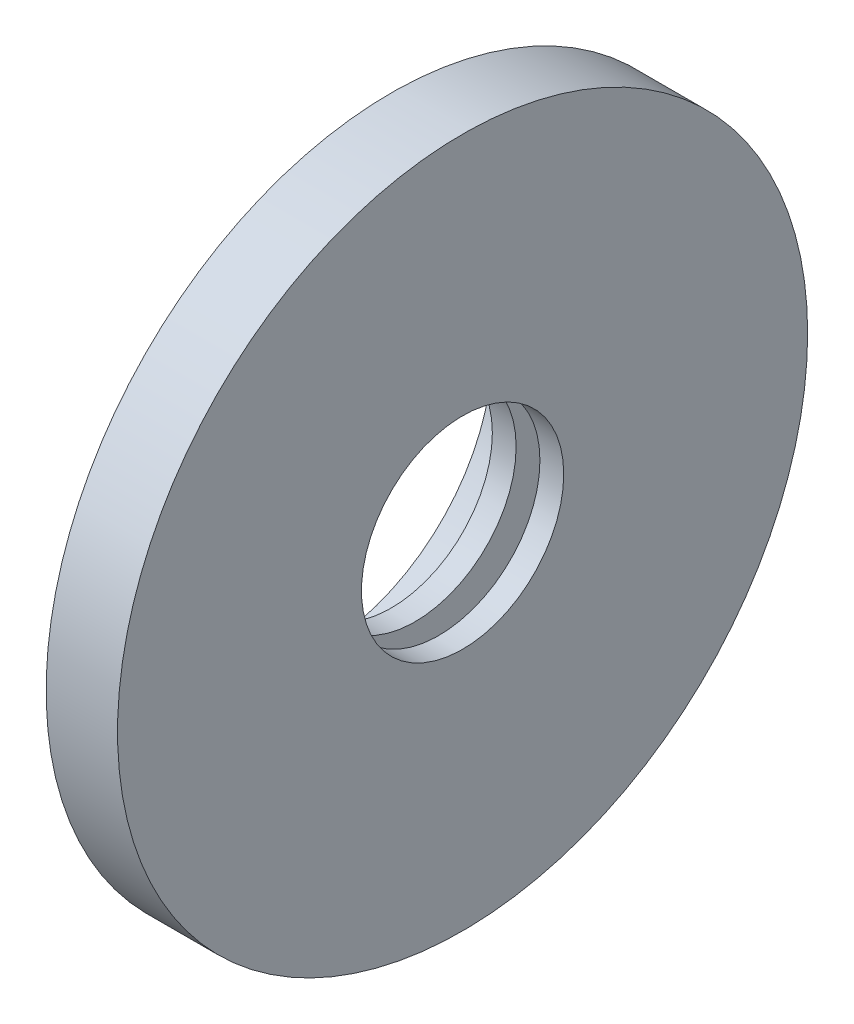
ISO-10303-21;
HEADER;
FILE_DESCRIPTION(('STEP AP214'),'2;1');
FILE_NAME('part.step','',(''),(''),'','','');
FILE_SCHEMA(('AUTOMOTIVE_DESIGN { 1 0 10303 214 1 1 1 1 }'));
ENDSEC;
DATA;
#1=APPLICATION_CONTEXT('core data for automotive mechanical design processes');
#2=APPLICATION_PROTOCOL_DEFINITION('international standard','automotive_design',2000,#1);
#3=PRODUCT_CONTEXT('',#1,'mechanical');
#4=PRODUCT('Part','Part','',(#3));
#5=PRODUCT_RELATED_PRODUCT_CATEGORY('part','',(#4));
#6=PRODUCT_DEFINITION_FORMATION('','',#4);
#7=PRODUCT_DEFINITION_CONTEXT('part definition',#1,'design');
#8=PRODUCT_DEFINITION('design','',#6,#7);
#9=PRODUCT_DEFINITION_SHAPE('','',#8);
#10=(LENGTH_UNIT() NAMED_UNIT(*) SI_UNIT(.MILLI.,.METRE.));
#11=(NAMED_UNIT(*) PLANE_ANGLE_UNIT() SI_UNIT($,.RADIAN.));
#12=(NAMED_UNIT(*) SI_UNIT($,.STERADIAN.) SOLID_ANGLE_UNIT());
#13=UNCERTAINTY_MEASURE_WITH_UNIT(LENGTH_MEASURE(1.E-05),#10,'distance_accuracy_value','');
#14=(GEOMETRIC_REPRESENTATION_CONTEXT(3) GLOBAL_UNCERTAINTY_ASSIGNED_CONTEXT((#13)) GLOBAL_UNIT_ASSIGNED_CONTEXT((#10,
#11,#12)) REPRESENTATION_CONTEXT('',''));
#15=CARTESIAN_POINT('',(0.,0.,0.));
#16=DIRECTION('',(0.,0.,1.));
#17=DIRECTION('',(1.,0.,0.));
#18=AXIS2_PLACEMENT_3D('',#15,#16,#17);
#19=CARTESIAN_POINT('',(0.,0.,0.));
#20=DIRECTION('',(-1.,0.,0.));
#21=DIRECTION('',(0.,0.,1.));
#22=AXIS2_PLACEMENT_3D('',#19,#20,#21);
#23=PLANE('',#22);
#24=CARTESIAN_POINT('',(0.,0.,0.));
#25=DIRECTION('',(1.,0.,0.));
#26=DIRECTION('',(0.,0.,-1.));
#27=AXIS2_PLACEMENT_3D('',#24,#25,#26);
#28=CIRCLE('',#27,8.5);
#29=CARTESIAN_POINT('',(0.,0.,-8.5));
#30=VERTEX_POINT('',#29);
#31=EDGE_CURVE('E72',#30,#30,#28,.T.);
#32=ORIENTED_EDGE('',*,*,#31,.T.);
#33=EDGE_LOOP('',(#32));
#34=FACE_BOUND('',#33,.T.);
#35=CARTESIAN_POINT('',(0.,0.,0.));
#36=DIRECTION('',(1.,0.,0.));
#37=DIRECTION('',(0.,0.,-1.));
#38=AXIS2_PLACEMENT_3D('',#35,#36,#37);
#39=CIRCLE('',#38,14.5);
#40=CARTESIAN_POINT('',(0.,0.,-14.5));
#41=VERTEX_POINT('',#40);
#42=EDGE_CURVE('E10',#41,#41,#39,.T.);
#43=ORIENTED_EDGE('',*,*,#42,.F.);
#44=EDGE_LOOP('',(#43));
#45=FACE_BOUND('',#44,.T.);
#46=ADVANCED_FACE('F41',(#34,#45),#23,.T.);
#47=CARTESIAN_POINT('',(0.,0.,0.));
#48=DIRECTION('',(1.,0.,0.));
#49=DIRECTION('',(0.,0.,-1.));
#50=AXIS2_PLACEMENT_3D('',#47,#48,#49);
#51=CYLINDRICAL_SURFACE('',#50,14.5);
#52=ORIENTED_EDGE('',*,*,#42,.T.);
#53=EDGE_LOOP('',(#52));
#54=FACE_BOUND('',#53,.T.);
#55=CARTESIAN_POINT('',(-6.,0.,0.));
#56=DIRECTION('',(1.,0.,0.));
#57=DIRECTION('',(0.,0.,-1.));
#58=AXIS2_PLACEMENT_3D('',#55,#56,#57);
#59=CIRCLE('',#58,14.5);
#60=CARTESIAN_POINT('',(-6.,0.,-14.5));
#61=VERTEX_POINT('',#60);
#62=EDGE_CURVE('E48',#61,#61,#59,.T.);
#63=ORIENTED_EDGE('',*,*,#62,.F.);
#64=EDGE_LOOP('',(#63));
#65=FACE_BOUND('',#64,.T.);
#66=ADVANCED_FACE('F118',(#54,#65),#51,.F.);
#67=CARTESIAN_POINT('',(-6.,14.5,0.));
#68=DIRECTION('',(-1.,0.,0.));
#69=DIRECTION('',(0.,0.,1.));
#70=AXIS2_PLACEMENT_3D('',#67,#68,#69);
#71=PLANE('',#70);
#72=ORIENTED_EDGE('',*,*,#62,.T.);
#73=EDGE_LOOP('',(#72));
#74=FACE_BOUND('',#73,.T.);
#75=CARTESIAN_POINT('',(-6.,0.,0.));
#76=DIRECTION('',(1.,0.,0.));
#77=DIRECTION('',(0.,0.,-1.));
#78=AXIS2_PLACEMENT_3D('',#75,#76,#77);
#79=CIRCLE('',#78,18.5);
#80=CARTESIAN_POINT('',(-6.,0.,-18.5));
#81=VERTEX_POINT('',#80);
#82=EDGE_CURVE('E53',#81,#81,#79,.T.);
#83=ORIENTED_EDGE('',*,*,#82,.F.);
#84=EDGE_LOOP('',(#83));
#85=FACE_BOUND('',#84,.T.);
#86=ADVANCED_FACE('F123',(#74,#85),#71,.T.);
#87=CARTESIAN_POINT('',(0.,0.,0.));
#88=DIRECTION('',(1.,0.,0.));
#89=DIRECTION('',(0.,0.,-1.));
#90=AXIS2_PLACEMENT_3D('',#87,#88,#89);
#91=CYLINDRICAL_SURFACE('',#90,18.5);
#92=ORIENTED_EDGE('',*,*,#82,.T.);
#93=EDGE_LOOP('',(#92));
#94=FACE_BOUND('',#93,.T.);
#95=CARTESIAN_POINT('',(0.,0.,0.));
#96=DIRECTION('',(1.,0.,0.));
#97=DIRECTION('',(0.,0.,-1.));
#98=AXIS2_PLACEMENT_3D('',#95,#96,#97);
#99=CIRCLE('',#98,18.5);
#100=CARTESIAN_POINT('',(0.,0.,-18.5));
#101=VERTEX_POINT('',#100);
#102=EDGE_CURVE('E58',#101,#101,#99,.T.);
#103=ORIENTED_EDGE('',*,*,#102,.F.);
#104=EDGE_LOOP('',(#103));
#105=FACE_BOUND('',#104,.T.);
#106=ADVANCED_FACE('F114',(#94,#105),#91,.T.);
#107=CARTESIAN_POINT('',(0.,18.5,0.));
#108=DIRECTION('',(-1.,0.,0.));
#109=DIRECTION('',(0.,0.,1.));
#110=AXIS2_PLACEMENT_3D('',#107,#108,#109);
#111=PLANE('',#110);
#112=ORIENTED_EDGE('',*,*,#102,.T.);
#113=EDGE_LOOP('',(#112));
#114=FACE_BOUND('',#113,.T.);
#115=CARTESIAN_POINT('',(0.,0.,0.));
#116=DIRECTION('',(1.,0.,0.));
#117=DIRECTION('',(0.,0.,-1.));
#118=AXIS2_PLACEMENT_3D('',#115,#116,#117);
#119=CIRCLE('',#118,29.);
#120=CARTESIAN_POINT('',(0.,0.,-29.));
#121=VERTEX_POINT('',#120);
#122=EDGE_CURVE('E64',#121,#121,#119,.T.);
#123=ORIENTED_EDGE('',*,*,#122,.F.);
#124=EDGE_LOOP('',(#123));
#125=FACE_BOUND('',#124,.T.);
#126=ADVANCED_FACE('F108',(#114,#125),#111,.T.);
#127=CARTESIAN_POINT('',(0.,0.,0.));
#128=DIRECTION('',(1.,0.,0.));
#129=DIRECTION('',(0.,0.,-1.));
#130=AXIS2_PLACEMENT_3D('',#127,#128,#129);
#131=CYLINDRICAL_SURFACE('',#130,29.);
#132=ORIENTED_EDGE('',*,*,#122,.T.);
#133=EDGE_LOOP('',(#132));
#134=FACE_BOUND('',#133,.T.);
#135=CARTESIAN_POINT('',(6.,0.,0.));
#136=DIRECTION('',(1.,0.,0.));
#137=DIRECTION('',(0.,0.,-1.));
#138=AXIS2_PLACEMENT_3D('',#135,#136,#137);
#139=CIRCLE('',#138,29.);
#140=CARTESIAN_POINT('',(6.,0.,-29.));
#141=VERTEX_POINT('',#140);
#142=EDGE_CURVE('E68',#141,#141,#139,.T.);
#143=ORIENTED_EDGE('',*,*,#142,.F.);
#144=EDGE_LOOP('',(#143));
#145=FACE_BOUND('',#144,.T.);
#146=ADVANCED_FACE('F103',(#134,#145),#131,.T.);
#147=CARTESIAN_POINT('',(6.,29.,0.));
#148=DIRECTION('',(1.,0.,0.));
#149=DIRECTION('',(0.,0.,-1.));
#150=AXIS2_PLACEMENT_3D('',#147,#148,#149);
#151=PLANE('',#150);
#152=CARTESIAN_POINT('',(6.,0.,0.));
#153=DIRECTION('',(1.,0.,0.));
#154=DIRECTION('',(0.,0.,-1.));
#155=AXIS2_PLACEMENT_3D('',#152,#153,#154);
#156=CIRCLE('',#155,8.5);
#157=CARTESIAN_POINT('',(6.,0.,-8.5));
#158=VERTEX_POINT('',#157);
#159=EDGE_CURVE('E92',#158,#158,#156,.T.);
#160=ORIENTED_EDGE('',*,*,#159,.F.);
#161=EDGE_LOOP('',(#160));
#162=FACE_BOUND('',#161,.T.);
#163=ORIENTED_EDGE('',*,*,#142,.T.);
#164=EDGE_LOOP('',(#163));
#165=FACE_BOUND('',#164,.T.);
#166=ADVANCED_FACE('F99',(#162,#165),#151,.T.);
#167=CARTESIAN_POINT('',(0.,0.,0.));
#168=DIRECTION('',(1.,0.,0.));
#169=DIRECTION('',(0.,0.,-1.));
#170=AXIS2_PLACEMENT_3D('',#167,#168,#169);
#171=CYLINDRICAL_SURFACE('',#170,8.5);
#172=ORIENTED_EDGE('',*,*,#31,.F.);
#173=EDGE_LOOP('',(#172));
#174=FACE_BOUND('',#173,.T.);
#175=CARTESIAN_POINT('',(1.99999999999999,0.,0.));
#176=DIRECTION('',(1.,0.,0.));
#177=DIRECTION('',(0.,0.,-1.));
#178=AXIS2_PLACEMENT_3D('',#175,#176,#177);
#179=CIRCLE('',#178,8.5);
#180=CARTESIAN_POINT('',(1.99999999999999,0.,-8.5));
#181=VERTEX_POINT('',#180);
#182=EDGE_CURVE('E76',#181,#181,#179,.T.);
#183=ORIENTED_EDGE('',*,*,#182,.T.);
#184=EDGE_LOOP('',(#183));
#185=FACE_BOUND('',#184,.T.);
#186=ADVANCED_FACE('F102',(#174,#185),#171,.F.);
#187=CARTESIAN_POINT('',(1.99999999999999,8.5,0.));
#188=DIRECTION('',(-1.,0.,0.));
#189=DIRECTION('',(0.,0.,1.));
#190=AXIS2_PLACEMENT_3D('',#187,#188,#189);
#191=PLANE('',#190);
#192=ORIENTED_EDGE('',*,*,#182,.F.);
#193=EDGE_LOOP('',(#192));
#194=FACE_BOUND('',#193,.T.);
#195=CARTESIAN_POINT('',(1.99999999999999,0.,0.));
#196=DIRECTION('',(1.,0.,0.));
#197=DIRECTION('',(0.,0.,-1.));
#198=AXIS2_PLACEMENT_3D('',#195,#196,#197);
#199=CIRCLE('',#198,12.5);
#200=CARTESIAN_POINT('',(1.99999999999999,0.,-12.5));
#201=VERTEX_POINT('',#200);
#202=EDGE_CURVE('E80',#201,#201,#199,.T.);
#203=ORIENTED_EDGE('',*,*,#202,.T.);
#204=EDGE_LOOP('',(#203));
#205=FACE_BOUND('',#204,.T.);
#206=ADVANCED_FACE('F129',(#194,#205),#191,.F.);
#207=CARTESIAN_POINT('',(0.,0.,0.));
#208=DIRECTION('',(1.,0.,0.));
#209=DIRECTION('',(0.,0.,-1.));
#210=AXIS2_PLACEMENT_3D('',#207,#208,#209);
#211=CYLINDRICAL_SURFACE('',#210,12.5);
#212=ORIENTED_EDGE('',*,*,#202,.F.);
#213=EDGE_LOOP('',(#212));
#214=FACE_BOUND('',#213,.T.);
#215=CARTESIAN_POINT('',(3.99999999999999,0.,0.));
#216=DIRECTION('',(1.,0.,0.));
#217=DIRECTION('',(0.,0.,-1.));
#218=AXIS2_PLACEMENT_3D('',#215,#216,#217);
#219=CIRCLE('',#218,12.5);
#220=CARTESIAN_POINT('',(3.99999999999999,0.,-12.5));
#221=VERTEX_POINT('',#220);
#222=EDGE_CURVE('E84',#221,#221,#219,.T.);
#223=ORIENTED_EDGE('',*,*,#222,.T.);
#224=EDGE_LOOP('',(#223));
#225=FACE_BOUND('',#224,.T.);
#226=ADVANCED_FACE('F135',(#214,#225),#211,.F.);
#227=CARTESIAN_POINT('',(3.99999999999999,12.5,0.));
#228=DIRECTION('',(1.,0.,0.));
#229=DIRECTION('',(0.,0.,-1.));
#230=AXIS2_PLACEMENT_3D('',#227,#228,#229);
#231=PLANE('',#230);
#232=ORIENTED_EDGE('',*,*,#222,.F.);
#233=EDGE_LOOP('',(#232));
#234=FACE_BOUND('',#233,.T.);
#235=CARTESIAN_POINT('',(3.99999999999999,0.,0.));
#236=DIRECTION('',(1.,0.,0.));
#237=DIRECTION('',(0.,0.,-1.));
#238=AXIS2_PLACEMENT_3D('',#235,#236,#237);
#239=CIRCLE('',#238,8.5);
#240=CARTESIAN_POINT('',(3.99999999999999,0.,-8.5));
#241=VERTEX_POINT('',#240);
#242=EDGE_CURVE('E88',#241,#241,#239,.T.);
#243=ORIENTED_EDGE('',*,*,#242,.T.);
#244=EDGE_LOOP('',(#243));
#245=FACE_BOUND('',#244,.T.);
#246=ADVANCED_FACE('F141',(#234,#245),#231,.F.);
#247=CARTESIAN_POINT('',(0.,0.,0.));
#248=DIRECTION('',(1.,0.,0.));
#249=DIRECTION('',(0.,0.,-1.));
#250=AXIS2_PLACEMENT_3D('',#247,#248,#249);
#251=CYLINDRICAL_SURFACE('',#250,8.5);
#252=ORIENTED_EDGE('',*,*,#242,.F.);
#253=EDGE_LOOP('',(#252));
#254=FACE_BOUND('',#253,.T.);
#255=ORIENTED_EDGE('',*,*,#159,.T.);
#256=EDGE_LOOP('',(#255));
#257=FACE_BOUND('',#256,.T.);
#258=ADVANCED_FACE('F97',(#254,#257),#251,.F.);
#259=CLOSED_SHELL('',(#46,#66,#86,#106,#126,#146,#166,#186,#206,#226,#246,#258));
#260=MANIFOLD_SOLID_BREP('B2',#259);
#261=ADVANCED_BREP_SHAPE_REPRESENTATION('',(#18,#260),#14);
#262=SHAPE_DEFINITION_REPRESENTATION(#9,#261);
ENDSEC;
END-ISO-10303-21;
